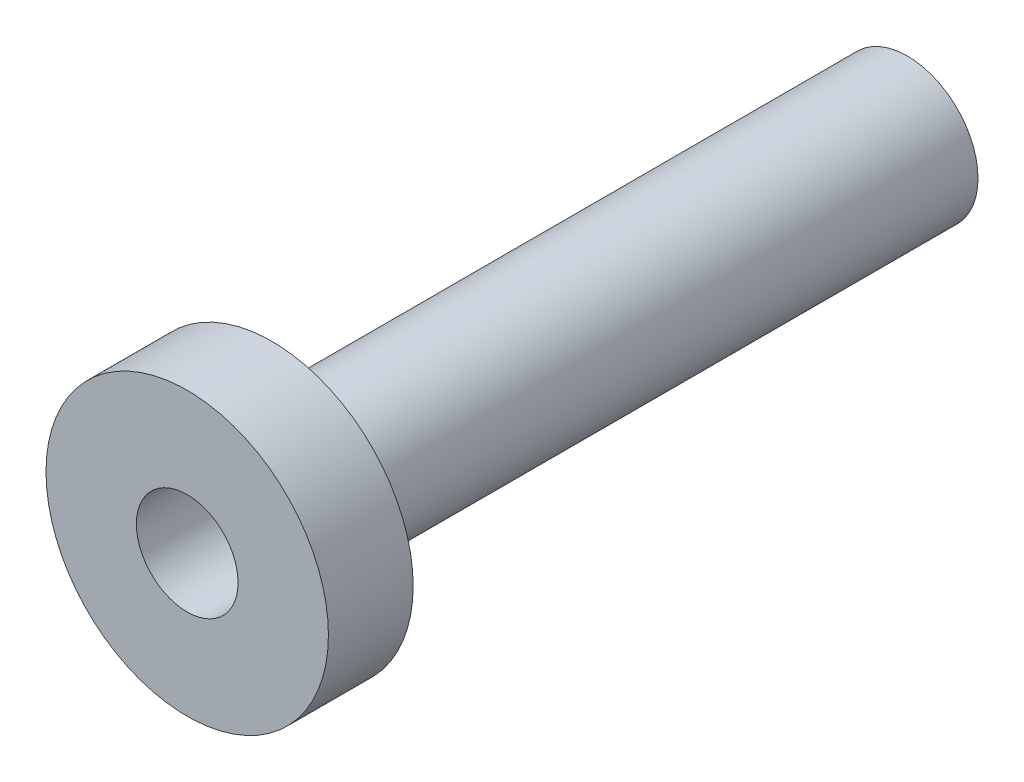
ISO-10303-21;
HEADER;
FILE_DESCRIPTION(('STEP AP214'),'2;1');
FILE_NAME('part.step','',(''),(''),'','','');
FILE_SCHEMA(('AUTOMOTIVE_DESIGN { 1 0 10303 214 1 1 1 1 }'));
ENDSEC;
DATA;
#1=APPLICATION_CONTEXT('core data for automotive mechanical design processes');
#2=APPLICATION_PROTOCOL_DEFINITION('international standard','automotive_design',2000,#1);
#3=PRODUCT_CONTEXT('',#1,'mechanical');
#4=PRODUCT('Part','Part','',(#3));
#5=PRODUCT_RELATED_PRODUCT_CATEGORY('part','',(#4));
#6=PRODUCT_DEFINITION_FORMATION('','',#4);
#7=PRODUCT_DEFINITION_CONTEXT('part definition',#1,'design');
#8=PRODUCT_DEFINITION('design','',#6,#7);
#9=PRODUCT_DEFINITION_SHAPE('','',#8);
#10=(LENGTH_UNIT() NAMED_UNIT(*) SI_UNIT(.MILLI.,.METRE.));
#11=(NAMED_UNIT(*) PLANE_ANGLE_UNIT() SI_UNIT($,.RADIAN.));
#12=(NAMED_UNIT(*) SI_UNIT($,.STERADIAN.) SOLID_ANGLE_UNIT());
#13=UNCERTAINTY_MEASURE_WITH_UNIT(LENGTH_MEASURE(1.E-05),#10,'distance_accuracy_value','');
#14=(GEOMETRIC_REPRESENTATION_CONTEXT(3) GLOBAL_UNCERTAINTY_ASSIGNED_CONTEXT((#13)) GLOBAL_UNIT_ASSIGNED_CONTEXT((#10,
#11,#12)) REPRESENTATION_CONTEXT('',''));
#15=CARTESIAN_POINT('',(0.,0.,0.));
#16=DIRECTION('',(0.,0.,1.));
#17=DIRECTION('',(1.,0.,0.));
#18=AXIS2_PLACEMENT_3D('',#15,#16,#17);
#19=CARTESIAN_POINT('',(0.,0.,24.));
#20=DIRECTION('',(0.,0.,-1.));
#21=DIRECTION('',(-1.,0.,0.));
#22=AXIS2_PLACEMENT_3D('',#19,#20,#21);
#23=CYLINDRICAL_SURFACE('',#22,2.5);
#24=CARTESIAN_POINT('',(0.,0.,0.));
#25=DIRECTION('',(0.,0.,1.));
#26=DIRECTION('',(1.,0.,0.));
#27=AXIS2_PLACEMENT_3D('',#24,#25,#26);
#28=CIRCLE('',#27,2.5);
#29=CARTESIAN_POINT('',(2.5,0.,0.));
#30=VERTEX_POINT('',#29);
#31=EDGE_CURVE('E49',#30,#30,#28,.T.);
#32=ORIENTED_EDGE('',*,*,#31,.T.);
#33=EDGE_LOOP('',(#32));
#34=FACE_BOUND('',#33,.T.);
#35=CARTESIAN_POINT('',(0.,0.,22.5));
#36=DIRECTION('',(0.,0.,1.));
#37=DIRECTION('',(1.,0.,0.));
#38=AXIS2_PLACEMENT_3D('',#35,#36,#37);
#39=CIRCLE('',#38,2.5);
#40=CARTESIAN_POINT('',(2.5,0.,22.5));
#41=VERTEX_POINT('',#40);
#42=EDGE_CURVE('E10',#41,#41,#39,.T.);
#43=ORIENTED_EDGE('',*,*,#42,.F.);
#44=EDGE_LOOP('',(#43));
#45=FACE_BOUND('',#44,.T.);
#46=ADVANCED_FACE('F43',(#34,#45),#23,.T.);
#47=CARTESIAN_POINT('',(0.,0.,24.));
#48=DIRECTION('',(0.,0.,-1.));
#49=DIRECTION('',(-1.,0.,0.));
#50=AXIS2_PLACEMENT_3D('',#47,#48,#49);
#51=CYLINDRICAL_SURFACE('',#50,1.8);
#52=CARTESIAN_POINT('',(0.,0.,25.5));
#53=DIRECTION('',(0.,0.,1.));
#54=DIRECTION('',(1.,0.,0.));
#55=AXIS2_PLACEMENT_3D('',#52,#53,#54);
#56=CIRCLE('',#55,1.8);
#57=CARTESIAN_POINT('',(1.8,0.,25.5));
#58=VERTEX_POINT('',#57);
#59=EDGE_CURVE('E73',#58,#58,#56,.T.);
#60=ORIENTED_EDGE('',*,*,#59,.T.);
#61=EDGE_LOOP('',(#60));
#62=FACE_BOUND('',#61,.T.);
#63=CARTESIAN_POINT('',(0.,0.,3.15));
#64=DIRECTION('',(0.,0.,-1.));
#65=DIRECTION('',(-1.,0.,0.));
#66=AXIS2_PLACEMENT_3D('',#63,#64,#65);
#67=CIRCLE('',#66,1.8);
#68=CARTESIAN_POINT('',(-1.8,0.,3.15));
#69=VERTEX_POINT('',#68);
#70=EDGE_CURVE('E53',#69,#69,#67,.T.);
#71=ORIENTED_EDGE('',*,*,#70,.T.);
#72=EDGE_LOOP('',(#71));
#73=FACE_BOUND('',#72,.T.);
#74=ADVANCED_FACE('F79',(#62,#73),#51,.F.);
#75=CARTESIAN_POINT('',(0.,0.,0.));
#76=DIRECTION('',(0.,0.,1.));
#77=DIRECTION('',(1.,0.,0.));
#78=AXIS2_PLACEMENT_3D('',#75,#76,#77);
#79=PLANE('',#78);
#80=CARTESIAN_POINT('',(0.,0.,0.));
#81=DIRECTION('',(0.,0.,1.));
#82=DIRECTION('',(1.,0.,0.));
#83=AXIS2_PLACEMENT_3D('',#80,#81,#82);
#84=CIRCLE('',#83,1.265);
#85=CARTESIAN_POINT('',(1.265,0.,0.));
#86=VERTEX_POINT('',#85);
#87=EDGE_CURVE('E58',#86,#86,#84,.T.);
#88=ORIENTED_EDGE('',*,*,#87,.T.);
#89=EDGE_LOOP('',(#88));
#90=FACE_BOUND('',#89,.T.);
#91=ORIENTED_EDGE('',*,*,#31,.F.);
#92=EDGE_LOOP('',(#91));
#93=FACE_BOUND('',#92,.T.);
#94=ADVANCED_FACE('F100',(#90,#93),#79,.F.);
#95=CARTESIAN_POINT('',(0.,0.,3.15));
#96=DIRECTION('',(0.,0.,-1.));
#97=DIRECTION('',(-1.,0.,0.));
#98=AXIS2_PLACEMENT_3D('',#95,#96,#97);
#99=PLANE('',#98);
#100=CARTESIAN_POINT('',(0.,0.,3.15));
#101=DIRECTION('',(0.,0.,-1.));
#102=DIRECTION('',(-1.,0.,0.));
#103=AXIS2_PLACEMENT_3D('',#100,#101,#102);
#104=CIRCLE('',#103,1.265);
#105=CARTESIAN_POINT('',(-1.265,0.,3.15));
#106=VERTEX_POINT('',#105);
#107=EDGE_CURVE('E61',#106,#106,#104,.T.);
#108=ORIENTED_EDGE('',*,*,#107,.T.);
#109=EDGE_LOOP('',(#108));
#110=FACE_BOUND('',#109,.T.);
#111=ORIENTED_EDGE('',*,*,#70,.F.);
#112=EDGE_LOOP('',(#111));
#113=FACE_BOUND('',#112,.T.);
#114=ADVANCED_FACE('F94',(#110,#113),#99,.F.);
#115=CARTESIAN_POINT('',(0.,0.,24.));
#116=DIRECTION('',(0.,0.,-1.));
#117=DIRECTION('',(-1.,0.,0.));
#118=AXIS2_PLACEMENT_3D('',#115,#116,#117);
#119=CYLINDRICAL_SURFACE('',#118,1.265);
#120=ORIENTED_EDGE('',*,*,#107,.F.);
#121=EDGE_LOOP('',(#120));
#122=FACE_BOUND('',#121,.T.);
#123=ORIENTED_EDGE('',*,*,#87,.F.);
#124=EDGE_LOOP('',(#123));
#125=FACE_BOUND('',#124,.T.);
#126=ADVANCED_FACE('F85',(#122,#125),#119,.F.);
#127=CARTESIAN_POINT('',(0.,0.,25.5));
#128=DIRECTION('',(0.,0.,1.));
#129=DIRECTION('',(1.,0.,0.));
#130=AXIS2_PLACEMENT_3D('',#127,#128,#129);
#131=PLANE('',#130);
#132=CARTESIAN_POINT('',(0.,0.,25.5));
#133=DIRECTION('',(0.,0.,1.));
#134=DIRECTION('',(1.,0.,0.));
#135=AXIS2_PLACEMENT_3D('',#132,#133,#134);
#136=CIRCLE('',#135,5.);
#137=CARTESIAN_POINT('',(5.,0.,25.5));
#138=VERTEX_POINT('',#137);
#139=EDGE_CURVE('E63',#138,#138,#136,.T.);
#140=ORIENTED_EDGE('',*,*,#139,.T.);
#141=EDGE_LOOP('',(#140));
#142=FACE_BOUND('',#141,.T.);
#143=ORIENTED_EDGE('',*,*,#59,.F.);
#144=EDGE_LOOP('',(#143));
#145=FACE_BOUND('',#144,.T.);
#146=ADVANCED_FACE('F82',(#142,#145),#131,.T.);
#147=CARTESIAN_POINT('',(0.,0.,22.5));
#148=DIRECTION('',(0.,0.,1.));
#149=DIRECTION('',(1.,0.,0.));
#150=AXIS2_PLACEMENT_3D('',#147,#148,#149);
#151=PLANE('',#150);
#152=ORIENTED_EDGE('',*,*,#42,.T.);
#153=EDGE_LOOP('',(#152));
#154=FACE_BOUND('',#153,.T.);
#155=CARTESIAN_POINT('',(0.,0.,22.5));
#156=DIRECTION('',(0.,0.,1.));
#157=DIRECTION('',(1.,0.,0.));
#158=AXIS2_PLACEMENT_3D('',#155,#156,#157);
#159=CIRCLE('',#158,5.);
#160=CARTESIAN_POINT('',(5.,0.,22.5));
#161=VERTEX_POINT('',#160);
#162=EDGE_CURVE('E68',#161,#161,#159,.T.);
#163=ORIENTED_EDGE('',*,*,#162,.F.);
#164=EDGE_LOOP('',(#163));
#165=FACE_BOUND('',#164,.T.);
#166=ADVANCED_FACE('F84',(#154,#165),#151,.F.);
#167=CARTESIAN_POINT('',(0.,0.,25.5));
#168=DIRECTION('',(0.,0.,-1.));
#169=DIRECTION('',(-1.,0.,0.));
#170=AXIS2_PLACEMENT_3D('',#167,#168,#169);
#171=CYLINDRICAL_SURFACE('',#170,5.);
#172=ORIENTED_EDGE('',*,*,#139,.F.);
#173=EDGE_LOOP('',(#172));
#174=FACE_BOUND('',#173,.T.);
#175=ORIENTED_EDGE('',*,*,#162,.T.);
#176=EDGE_LOOP('',(#175));
#177=FACE_BOUND('',#176,.T.);
#178=ADVANCED_FACE('F91',(#174,#177),#171,.T.);
#179=CLOSED_SHELL('',(#46,#74,#94,#114,#126,#146,#166,#178));
#180=MANIFOLD_SOLID_BREP('B2',#179);
#181=ADVANCED_BREP_SHAPE_REPRESENTATION('',(#18,#180),#14);
#182=SHAPE_DEFINITION_REPRESENTATION(#9,#181);
ENDSEC;
END-ISO-10303-21;
